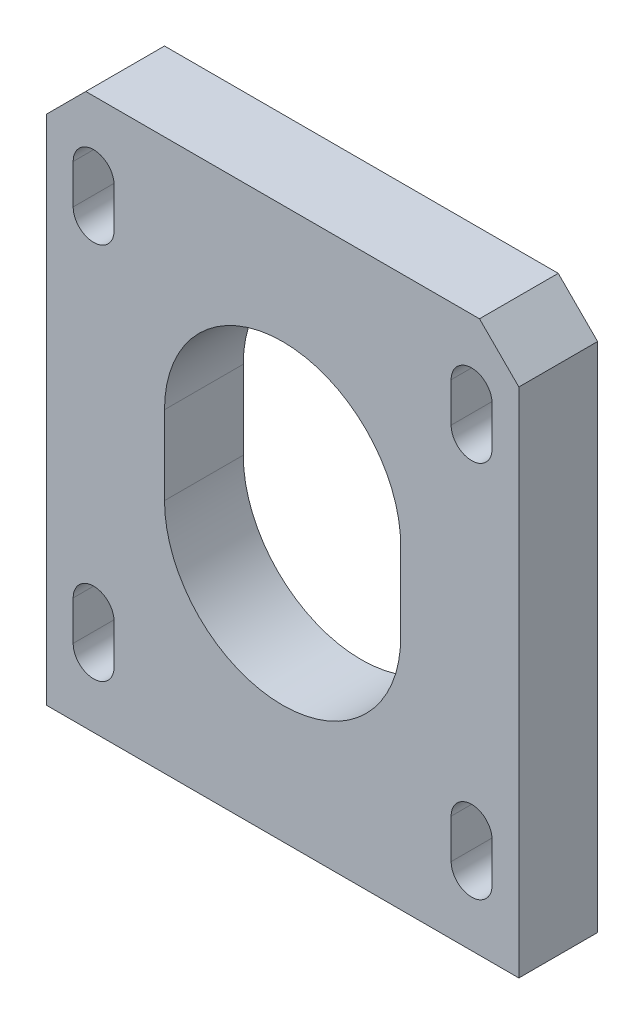
ISO-10303-21;
HEADER;
FILE_DESCRIPTION(('STEP AP214'),'2;1');
FILE_NAME('part.step','',(''),(''),'','','');
FILE_SCHEMA(('AUTOMOTIVE_DESIGN { 1 0 10303 214 1 1 1 1 }'));
ENDSEC;
DATA;
#1=APPLICATION_CONTEXT('core data for automotive mechanical design processes');
#2=APPLICATION_PROTOCOL_DEFINITION('international standard','automotive_design',2000,#1);
#3=PRODUCT_CONTEXT('',#1,'mechanical');
#4=PRODUCT('Part','Part','',(#3));
#5=PRODUCT_RELATED_PRODUCT_CATEGORY('part','',(#4));
#6=PRODUCT_DEFINITION_FORMATION('','',#4);
#7=PRODUCT_DEFINITION_CONTEXT('part definition',#1,'design');
#8=PRODUCT_DEFINITION('design','',#6,#7);
#9=PRODUCT_DEFINITION_SHAPE('','',#8);
#10=(LENGTH_UNIT() NAMED_UNIT(*) SI_UNIT(.MILLI.,.METRE.));
#11=(NAMED_UNIT(*) PLANE_ANGLE_UNIT() SI_UNIT($,.RADIAN.));
#12=(NAMED_UNIT(*) SI_UNIT($,.STERADIAN.) SOLID_ANGLE_UNIT());
#13=UNCERTAINTY_MEASURE_WITH_UNIT(LENGTH_MEASURE(1.E-05),#10,'distance_accuracy_value','');
#14=(GEOMETRIC_REPRESENTATION_CONTEXT(3) GLOBAL_UNCERTAINTY_ASSIGNED_CONTEXT((#13)) GLOBAL_UNIT_ASSIGNED_CONTEXT((#10,
#11,#12)) REPRESENTATION_CONTEXT('',''));
#15=CARTESIAN_POINT('',(0.,0.,0.));
#16=DIRECTION('',(0.,0.,1.));
#17=DIRECTION('',(1.,0.,0.));
#18=AXIS2_PLACEMENT_3D('',#15,#16,#17);
#19=CARTESIAN_POINT('',(0.,0.,10.));
#20=DIRECTION('',(1.,0.,0.));
#21=DIRECTION('',(0.,0.,-1.));
#22=AXIS2_PLACEMENT_3D('',#19,#20,#21);
#23=PLANE('',#22);
#24=DIRECTION('',(0.,-1.,0.));
#25=VECTOR('',#24,1.);
#26=CARTESIAN_POINT('',(0.,0.,10.));
#27=LINE('',#26,#25);
#28=CARTESIAN_POINT('',(0.,65.,10.));
#29=VERTEX_POINT('',#28);
#30=CARTESIAN_POINT('',(0.,0.,10.));
#31=VERTEX_POINT('',#30);
#32=EDGE_CURVE('E381',#29,#31,#27,.T.);
#33=ORIENTED_EDGE('',*,*,#32,.F.);
#34=DIRECTION('',(0.,0.,-1.));
#35=VECTOR('',#34,1.);
#36=CARTESIAN_POINT('',(0.,65.,10.));
#37=LINE('',#36,#35);
#38=CARTESIAN_POINT('',(0.,65.,0.));
#39=VERTEX_POINT('',#38);
#40=EDGE_CURVE('E11',#29,#39,#37,.T.);
#41=ORIENTED_EDGE('',*,*,#40,.T.);
#42=DIRECTION('',(0.,-1.,0.));
#43=VECTOR('',#42,1.);
#44=CARTESIAN_POINT('',(0.,0.,0.));
#45=LINE('',#44,#43);
#46=CARTESIAN_POINT('',(0.,0.,0.));
#47=VERTEX_POINT('',#46);
#48=EDGE_CURVE('E374',#39,#47,#45,.T.);
#49=ORIENTED_EDGE('',*,*,#48,.T.);
#50=DIRECTION('',(0.,0.,-1.));
#51=VECTOR('',#50,1.);
#52=CARTESIAN_POINT('',(0.,0.,10.));
#53=LINE('',#52,#51);
#54=EDGE_CURVE('E400',#31,#47,#53,.T.);
#55=ORIENTED_EDGE('',*,*,#54,.F.);
#56=EDGE_LOOP('',(#33,#41,#49,#55));
#57=FACE_BOUND('',#56,.T.);
#58=ADVANCED_FACE('F33',(#57),#23,.F.);
#59=CARTESIAN_POINT('',(0.,0.,10.));
#60=DIRECTION('',(0.,1.,0.));
#61=DIRECTION('',(0.,0.,1.));
#62=AXIS2_PLACEMENT_3D('',#59,#60,#61);
#63=PLANE('',#62);
#64=DIRECTION('',(1.,0.,0.));
#65=VECTOR('',#64,1.);
#66=CARTESIAN_POINT('',(0.,0.,0.));
#67=LINE('',#66,#65);
#68=CARTESIAN_POINT('',(60.,0.,0.));
#69=VERTEX_POINT('',#68);
#70=EDGE_CURVE('E392',#47,#69,#67,.T.);
#71=ORIENTED_EDGE('',*,*,#70,.T.);
#72=DIRECTION('',(0.,0.,-1.));
#73=VECTOR('',#72,1.);
#74=CARTESIAN_POINT('',(60.,0.,10.));
#75=LINE('',#74,#73);
#76=CARTESIAN_POINT('',(60.,0.,10.));
#77=VERTEX_POINT('',#76);
#78=EDGE_CURVE('E390',#77,#69,#75,.T.);
#79=ORIENTED_EDGE('',*,*,#78,.F.);
#80=DIRECTION('',(1.,0.,0.));
#81=VECTOR('',#80,1.);
#82=CARTESIAN_POINT('',(0.,0.,10.));
#83=LINE('',#82,#81);
#84=EDGE_CURVE('E383',#31,#77,#83,.T.);
#85=ORIENTED_EDGE('',*,*,#84,.F.);
#86=ORIENTED_EDGE('',*,*,#54,.T.);
#87=EDGE_LOOP('',(#71,#79,#85,#86));
#88=FACE_BOUND('',#87,.T.);
#89=ADVANCED_FACE('F430',(#88),#63,.F.);
#90=CARTESIAN_POINT('',(60.,0.,10.));
#91=DIRECTION('',(-1.,0.,0.));
#92=DIRECTION('',(0.,0.,1.));
#93=AXIS2_PLACEMENT_3D('',#90,#91,#92);
#94=PLANE('',#93);
#95=DIRECTION('',(0.,1.,0.));
#96=VECTOR('',#95,1.);
#97=CARTESIAN_POINT('',(60.,0.,0.));
#98=LINE('',#97,#96);
#99=CARTESIAN_POINT('',(60.,65.,0.));
#100=VERTEX_POINT('',#99);
#101=EDGE_CURVE('E394',#69,#100,#98,.T.);
#102=ORIENTED_EDGE('',*,*,#101,.T.);
#103=DIRECTION('',(0.,0.,1.));
#104=VECTOR('',#103,1.);
#105=CARTESIAN_POINT('',(60.,65.,10.));
#106=LINE('',#105,#104);
#107=CARTESIAN_POINT('',(60.,65.,10.));
#108=VERTEX_POINT('',#107);
#109=EDGE_CURVE('E56',#100,#108,#106,.T.);
#110=ORIENTED_EDGE('',*,*,#109,.T.);
#111=DIRECTION('',(0.,1.,0.));
#112=VECTOR('',#111,1.);
#113=CARTESIAN_POINT('',(60.,0.,10.));
#114=LINE('',#113,#112);
#115=EDGE_CURVE('E386',#77,#108,#114,.T.);
#116=ORIENTED_EDGE('',*,*,#115,.F.);
#117=ORIENTED_EDGE('',*,*,#78,.T.);
#118=EDGE_LOOP('',(#102,#110,#116,#117));
#119=FACE_BOUND('',#118,.T.);
#120=ADVANCED_FACE('F426',(#119),#94,.F.);
#121=CARTESIAN_POINT('',(0.,70.,10.));
#122=DIRECTION('',(0.,-1.,0.));
#123=DIRECTION('',(0.,0.,-1.));
#124=AXIS2_PLACEMENT_3D('',#121,#122,#123);
#125=PLANE('',#124);
#126=DIRECTION('',(-1.,0.,0.));
#127=VECTOR('',#126,1.);
#128=CARTESIAN_POINT('',(0.,70.,10.));
#129=LINE('',#128,#127);
#130=CARTESIAN_POINT('',(55.,70.,10.));
#131=VERTEX_POINT('',#130);
#132=CARTESIAN_POINT('',(5.00000000000003,70.,10.));
#133=VERTEX_POINT('',#132);
#134=EDGE_CURVE('E388',#131,#133,#129,.T.);
#135=ORIENTED_EDGE('',*,*,#134,.F.);
#136=DIRECTION('',(0.,0.,-1.));
#137=VECTOR('',#136,1.);
#138=CARTESIAN_POINT('',(55.,70.,10.));
#139=LINE('',#138,#137);
#140=CARTESIAN_POINT('',(55.,70.,0.));
#141=VERTEX_POINT('',#140);
#142=EDGE_CURVE('E405',#131,#141,#139,.T.);
#143=ORIENTED_EDGE('',*,*,#142,.T.);
#144=DIRECTION('',(-1.,0.,0.));
#145=VECTOR('',#144,1.);
#146=CARTESIAN_POINT('',(0.,70.,0.));
#147=LINE('',#146,#145);
#148=CARTESIAN_POINT('',(5.00000000000003,70.,0.));
#149=VERTEX_POINT('',#148);
#150=EDGE_CURVE('E384',#141,#149,#147,.T.);
#151=ORIENTED_EDGE('',*,*,#150,.T.);
#152=DIRECTION('',(0.,0.,1.));
#153=VECTOR('',#152,1.);
#154=CARTESIAN_POINT('',(5.00000000000003,70.,10.));
#155=LINE('',#154,#153);
#156=EDGE_CURVE('E403',#149,#133,#155,.T.);
#157=ORIENTED_EDGE('',*,*,#156,.T.);
#158=EDGE_LOOP('',(#135,#143,#151,#157));
#159=FACE_BOUND('',#158,.T.);
#160=ADVANCED_FACE('F419',(#159),#125,.F.);
#161=CARTESIAN_POINT('',(0.,0.,10.));
#162=DIRECTION('',(0.,0.,-1.));
#163=DIRECTION('',(-1.,0.,0.));
#164=AXIS2_PLACEMENT_3D('',#161,#162,#163);
#165=PLANE('',#164);
#166=DIRECTION('',(0.,-1.,0.));
#167=VECTOR('',#166,1.);
#168=CARTESIAN_POINT('',(51.4,61.5,10.));
#169=LINE('',#168,#167);
#170=CARTESIAN_POINT('',(51.4,61.5,10.));
#171=VERTEX_POINT('',#170);
#172=CARTESIAN_POINT('',(51.4,56.5,10.));
#173=VERTEX_POINT('',#172);
#174=EDGE_CURVE('E243',#171,#173,#169,.T.);
#175=ORIENTED_EDGE('',*,*,#174,.F.);
#176=CARTESIAN_POINT('',(54.,61.5,10.));
#177=DIRECTION('',(0.,0.,1.));
#178=DIRECTION('',(-1.,0.,0.));
#179=AXIS2_PLACEMENT_3D('',#176,#177,#178);
#180=CIRCLE('',#179,2.59999999999998);
#181=CARTESIAN_POINT('',(56.6,61.5,10.));
#182=VERTEX_POINT('',#181);
#183=EDGE_CURVE('E216',#182,#171,#180,.T.);
#184=ORIENTED_EDGE('',*,*,#183,.F.);
#185=DIRECTION('',(0.,1.,0.));
#186=VECTOR('',#185,1.);
#187=CARTESIAN_POINT('',(56.6,61.5,10.));
#188=LINE('',#187,#186);
#189=CARTESIAN_POINT('',(56.6,56.5,10.));
#190=VERTEX_POINT('',#189);
#191=EDGE_CURVE('E234',#190,#182,#188,.T.);
#192=ORIENTED_EDGE('',*,*,#191,.F.);
#193=CARTESIAN_POINT('',(54.,56.5,10.));
#194=DIRECTION('',(0.,0.,1.));
#195=DIRECTION('',(-1.,0.,0.));
#196=AXIS2_PLACEMENT_3D('',#193,#194,#195);
#197=CIRCLE('',#196,2.59999999999998);
#198=EDGE_CURVE('E237',#173,#190,#197,.T.);
#199=ORIENTED_EDGE('',*,*,#198,.F.);
#200=EDGE_LOOP('',(#175,#184,#192,#199));
#201=FACE_BOUND('',#200,.T.);
#202=DIRECTION('',(0.,1.,0.));
#203=VECTOR('',#202,1.);
#204=CARTESIAN_POINT('',(56.6,8.49999999999997,10.));
#205=LINE('',#204,#203);
#206=CARTESIAN_POINT('',(56.6,8.49999999999997,10.));
#207=VERTEX_POINT('',#206);
#208=CARTESIAN_POINT('',(56.6,13.5,10.));
#209=VERTEX_POINT('',#208);
#210=EDGE_CURVE('E270',#207,#209,#205,.T.);
#211=ORIENTED_EDGE('',*,*,#210,.F.);
#212=CARTESIAN_POINT('',(54.,8.5,10.));
#213=DIRECTION('',(0.,0.,1.));
#214=DIRECTION('',(1.,0.,0.));
#215=AXIS2_PLACEMENT_3D('',#212,#213,#214);
#216=CIRCLE('',#215,2.59999999999998);
#217=CARTESIAN_POINT('',(51.4,8.49999999999997,10.));
#218=VERTEX_POINT('',#217);
#219=EDGE_CURVE('E268',#218,#207,#216,.T.);
#220=ORIENTED_EDGE('',*,*,#219,.F.);
#221=DIRECTION('',(0.,-1.,0.));
#222=VECTOR('',#221,1.);
#223=CARTESIAN_POINT('',(51.4,8.49999999999997,10.));
#224=LINE('',#223,#222);
#225=CARTESIAN_POINT('',(51.4,13.5,10.));
#226=VERTEX_POINT('',#225);
#227=EDGE_CURVE('E258',#226,#218,#224,.T.);
#228=ORIENTED_EDGE('',*,*,#227,.F.);
#229=CARTESIAN_POINT('',(54.,13.5,10.));
#230=DIRECTION('',(0.,0.,1.));
#231=DIRECTION('',(1.,0.,0.));
#232=AXIS2_PLACEMENT_3D('',#229,#230,#231);
#233=CIRCLE('',#232,2.59999999999998);
#234=EDGE_CURVE('E274',#209,#226,#233,.T.);
#235=ORIENTED_EDGE('',*,*,#234,.F.);
#236=EDGE_LOOP('',(#211,#220,#228,#235));
#237=FACE_BOUND('',#236,.T.);
#238=DIRECTION('',(0.,1.,0.));
#239=VECTOR('',#238,1.);
#240=CARTESIAN_POINT('',(8.59999999999998,8.49999999999997,10.));
#241=LINE('',#240,#239);
#242=CARTESIAN_POINT('',(8.59999999999998,8.49999999999997,10.));
#243=VERTEX_POINT('',#242);
#244=CARTESIAN_POINT('',(8.59999999999998,13.5,10.));
#245=VERTEX_POINT('',#244);
#246=EDGE_CURVE('E302',#243,#245,#241,.T.);
#247=ORIENTED_EDGE('',*,*,#246,.F.);
#248=CARTESIAN_POINT('',(6.,8.5,10.));
#249=DIRECTION('',(0.,0.,1.));
#250=DIRECTION('',(-1.,0.,0.));
#251=AXIS2_PLACEMENT_3D('',#248,#249,#250);
#252=CIRCLE('',#251,2.59999999999998);
#253=CARTESIAN_POINT('',(3.40000000000003,8.49999999999997,10.));
#254=VERTEX_POINT('',#253);
#255=EDGE_CURVE('E300',#254,#243,#252,.T.);
#256=ORIENTED_EDGE('',*,*,#255,.F.);
#257=DIRECTION('',(0.,-1.,0.));
#258=VECTOR('',#257,1.);
#259=CARTESIAN_POINT('',(3.40000000000003,8.49999999999997,10.));
#260=LINE('',#259,#258);
#261=CARTESIAN_POINT('',(3.40000000000002,13.5,10.));
#262=VERTEX_POINT('',#261);
#263=EDGE_CURVE('E290',#262,#254,#260,.T.);
#264=ORIENTED_EDGE('',*,*,#263,.F.);
#265=CARTESIAN_POINT('',(6.,13.5,10.));
#266=DIRECTION('',(0.,0.,1.));
#267=DIRECTION('',(-1.,0.,0.));
#268=AXIS2_PLACEMENT_3D('',#265,#266,#267);
#269=CIRCLE('',#268,2.59999999999998);
#270=EDGE_CURVE('E306',#245,#262,#269,.T.);
#271=ORIENTED_EDGE('',*,*,#270,.F.);
#272=EDGE_LOOP('',(#247,#256,#264,#271));
#273=FACE_BOUND('',#272,.T.);
#274=DIRECTION('',(0.,1.,0.));
#275=VECTOR('',#274,1.);
#276=CARTESIAN_POINT('',(45.,30.,10.));
#277=LINE('',#276,#275);
#278=CARTESIAN_POINT('',(45.,30.,10.));
#279=VERTEX_POINT('',#278);
#280=CARTESIAN_POINT('',(45.,40.,10.));
#281=VERTEX_POINT('',#280);
#282=EDGE_CURVE('E334',#279,#281,#277,.T.);
#283=ORIENTED_EDGE('',*,*,#282,.F.);
#284=CARTESIAN_POINT('',(30.,30.,10.));
#285=DIRECTION('',(0.,0.,1.));
#286=DIRECTION('',(1.,0.,0.));
#287=AXIS2_PLACEMENT_3D('',#284,#285,#286);
#288=CIRCLE('',#287,15.);
#289=CARTESIAN_POINT('',(15.,30.,10.));
#290=VERTEX_POINT('',#289);
#291=EDGE_CURVE('E332',#290,#279,#288,.T.);
#292=ORIENTED_EDGE('',*,*,#291,.F.);
#293=DIRECTION('',(0.,-1.,0.));
#294=VECTOR('',#293,1.);
#295=CARTESIAN_POINT('',(15.,30.,10.));
#296=LINE('',#295,#294);
#297=CARTESIAN_POINT('',(15.,40.,10.));
#298=VERTEX_POINT('',#297);
#299=EDGE_CURVE('E322',#298,#290,#296,.T.);
#300=ORIENTED_EDGE('',*,*,#299,.F.);
#301=CARTESIAN_POINT('',(30.,40.,10.));
#302=DIRECTION('',(0.,0.,1.));
#303=DIRECTION('',(1.,0.,0.));
#304=AXIS2_PLACEMENT_3D('',#301,#302,#303);
#305=CIRCLE('',#304,15.);
#306=EDGE_CURVE('E337',#281,#298,#305,.T.);
#307=ORIENTED_EDGE('',*,*,#306,.F.);
#308=EDGE_LOOP('',(#283,#292,#300,#307));
#309=FACE_BOUND('',#308,.T.);
#310=DIRECTION('',(0.,-1.,0.));
#311=VECTOR('',#310,1.);
#312=CARTESIAN_POINT('',(3.40000000000001,61.5,10.));
#313=LINE('',#312,#311);
#314=CARTESIAN_POINT('',(3.40000000000001,61.5,10.));
#315=VERTEX_POINT('',#314);
#316=CARTESIAN_POINT('',(3.40000000000001,56.5,10.));
#317=VERTEX_POINT('',#316);
#318=EDGE_CURVE('E364',#315,#317,#313,.T.);
#319=ORIENTED_EDGE('',*,*,#318,.F.);
#320=CARTESIAN_POINT('',(6.,61.5,10.));
#321=DIRECTION('',(0.,0.,1.));
#322=DIRECTION('',(1.,0.,0.));
#323=AXIS2_PLACEMENT_3D('',#320,#321,#322);
#324=CIRCLE('',#323,2.59999999999998);
#325=CARTESIAN_POINT('',(8.59999999999998,61.5,10.));
#326=VERTEX_POINT('',#325);
#327=EDGE_CURVE('E250',#326,#315,#324,.T.);
#328=ORIENTED_EDGE('',*,*,#327,.F.);
#329=DIRECTION('',(0.,1.,0.));
#330=VECTOR('',#329,1.);
#331=CARTESIAN_POINT('',(8.59999999999998,61.5,10.));
#332=LINE('',#331,#330);
#333=CARTESIAN_POINT('',(8.59999999999999,56.5,10.));
#334=VERTEX_POINT('',#333);
#335=EDGE_CURVE('E353',#334,#326,#332,.T.);
#336=ORIENTED_EDGE('',*,*,#335,.F.);
#337=CARTESIAN_POINT('',(6.,56.5,10.));
#338=DIRECTION('',(0.,0.,1.));
#339=DIRECTION('',(1.,0.,0.));
#340=AXIS2_PLACEMENT_3D('',#337,#338,#339);
#341=CIRCLE('',#340,2.59999999999998);
#342=EDGE_CURVE('E367',#317,#334,#341,.T.);
#343=ORIENTED_EDGE('',*,*,#342,.F.);
#344=EDGE_LOOP('',(#319,#328,#336,#343));
#345=FACE_BOUND('',#344,.T.);
#346=ORIENTED_EDGE('',*,*,#115,.T.);
#347=DIRECTION('',(0.707106781186547,-0.707106781186549,0.));
#348=VECTOR('',#347,1.);
#349=CARTESIAN_POINT('',(55.,70.,10.));
#350=LINE('',#349,#348);
#351=EDGE_CURVE('E41',#108,#131,#350,.F.);
#352=ORIENTED_EDGE('',*,*,#351,.T.);
#353=ORIENTED_EDGE('',*,*,#134,.T.);
#354=DIRECTION('',(0.707106781186549,0.707106781186547,0.));
#355=VECTOR('',#354,1.);
#356=CARTESIAN_POINT('',(0.,65.,10.));
#357=LINE('',#356,#355);
#358=EDGE_CURVE('E48',#133,#29,#357,.F.);
#359=ORIENTED_EDGE('',*,*,#358,.T.);
#360=ORIENTED_EDGE('',*,*,#32,.T.);
#361=ORIENTED_EDGE('',*,*,#84,.T.);
#362=EDGE_LOOP('',(#346,#352,#353,#359,#360,#361));
#363=FACE_BOUND('',#362,.T.);
#364=ADVANCED_FACE('F415',(#201,#237,#273,#309,#345,#363),#165,.F.);
#365=CARTESIAN_POINT('',(0.,0.,0.));
#366=DIRECTION('',(0.,0.,-1.));
#367=DIRECTION('',(-1.,0.,0.));
#368=AXIS2_PLACEMENT_3D('',#365,#366,#367);
#369=PLANE('',#368);
#370=CARTESIAN_POINT('',(54.,61.5,0.));
#371=DIRECTION('',(0.,0.,1.));
#372=DIRECTION('',(-1.,0.,0.));
#373=AXIS2_PLACEMENT_3D('',#370,#371,#372);
#374=CIRCLE('',#373,2.59999999999998);
#375=CARTESIAN_POINT('',(56.6,61.5,0.));
#376=VERTEX_POINT('',#375);
#377=CARTESIAN_POINT('',(51.4,61.5,0.));
#378=VERTEX_POINT('',#377);
#379=EDGE_CURVE('E213',#376,#378,#374,.T.);
#380=ORIENTED_EDGE('',*,*,#379,.T.);
#381=DIRECTION('',(0.,-1.,0.));
#382=VECTOR('',#381,1.);
#383=CARTESIAN_POINT('',(51.4,61.5,0.));
#384=LINE('',#383,#382);
#385=CARTESIAN_POINT('',(51.4,56.5,0.));
#386=VERTEX_POINT('',#385);
#387=EDGE_CURVE('E225',#378,#386,#384,.T.);
#388=ORIENTED_EDGE('',*,*,#387,.T.);
#389=CARTESIAN_POINT('',(54.,56.5,0.));
#390=DIRECTION('',(0.,0.,1.));
#391=DIRECTION('',(-1.,0.,0.));
#392=AXIS2_PLACEMENT_3D('',#389,#390,#391);
#393=CIRCLE('',#392,2.59999999999998);
#394=CARTESIAN_POINT('',(56.6,56.5,0.));
#395=VERTEX_POINT('',#394);
#396=EDGE_CURVE('E229',#386,#395,#393,.T.);
#397=ORIENTED_EDGE('',*,*,#396,.T.);
#398=DIRECTION('',(0.,1.,0.));
#399=VECTOR('',#398,1.);
#400=CARTESIAN_POINT('',(56.6,61.5,0.));
#401=LINE('',#400,#399);
#402=EDGE_CURVE('E221',#395,#376,#401,.T.);
#403=ORIENTED_EDGE('',*,*,#402,.T.);
#404=EDGE_LOOP('',(#380,#388,#397,#403));
#405=FACE_BOUND('',#404,.T.);
#406=CARTESIAN_POINT('',(54.,8.5,0.));
#407=DIRECTION('',(0.,0.,1.));
#408=DIRECTION('',(1.,0.,0.));
#409=AXIS2_PLACEMENT_3D('',#406,#407,#408);
#410=CIRCLE('',#409,2.59999999999998);
#411=CARTESIAN_POINT('',(51.4,8.49999999999997,0.));
#412=VERTEX_POINT('',#411);
#413=CARTESIAN_POINT('',(56.6,8.49999999999997,0.));
#414=VERTEX_POINT('',#413);
#415=EDGE_CURVE('E254',#412,#414,#410,.T.);
#416=ORIENTED_EDGE('',*,*,#415,.T.);
#417=DIRECTION('',(0.,1.,0.));
#418=VECTOR('',#417,1.);
#419=CARTESIAN_POINT('',(56.6,8.49999999999997,0.));
#420=LINE('',#419,#418);
#421=CARTESIAN_POINT('',(56.6,13.5,0.));
#422=VERTEX_POINT('',#421);
#423=EDGE_CURVE('E257',#414,#422,#420,.T.);
#424=ORIENTED_EDGE('',*,*,#423,.T.);
#425=CARTESIAN_POINT('',(54.,13.5,0.));
#426=DIRECTION('',(0.,0.,1.));
#427=DIRECTION('',(1.,0.,0.));
#428=AXIS2_PLACEMENT_3D('',#425,#426,#427);
#429=CIRCLE('',#428,2.59999999999998);
#430=CARTESIAN_POINT('',(51.4,13.5,0.));
#431=VERTEX_POINT('',#430);
#432=EDGE_CURVE('E261',#422,#431,#429,.T.);
#433=ORIENTED_EDGE('',*,*,#432,.T.);
#434=DIRECTION('',(0.,-1.,0.));
#435=VECTOR('',#434,1.);
#436=CARTESIAN_POINT('',(51.4,8.49999999999997,0.));
#437=LINE('',#436,#435);
#438=EDGE_CURVE('E264',#431,#412,#437,.T.);
#439=ORIENTED_EDGE('',*,*,#438,.T.);
#440=EDGE_LOOP('',(#416,#424,#433,#439));
#441=FACE_BOUND('',#440,.T.);
#442=CARTESIAN_POINT('',(6.,8.5,0.));
#443=DIRECTION('',(0.,0.,1.));
#444=DIRECTION('',(-1.,0.,0.));
#445=AXIS2_PLACEMENT_3D('',#442,#443,#444);
#446=CIRCLE('',#445,2.59999999999998);
#447=CARTESIAN_POINT('',(3.40000000000003,8.49999999999997,0.));
#448=VERTEX_POINT('',#447);
#449=CARTESIAN_POINT('',(8.59999999999998,8.49999999999997,0.));
#450=VERTEX_POINT('',#449);
#451=EDGE_CURVE('E286',#448,#450,#446,.T.);
#452=ORIENTED_EDGE('',*,*,#451,.T.);
#453=DIRECTION('',(0.,1.,0.));
#454=VECTOR('',#453,1.);
#455=CARTESIAN_POINT('',(8.59999999999998,8.49999999999997,0.));
#456=LINE('',#455,#454);
#457=CARTESIAN_POINT('',(8.59999999999998,13.5,0.));
#458=VERTEX_POINT('',#457);
#459=EDGE_CURVE('E289',#450,#458,#456,.T.);
#460=ORIENTED_EDGE('',*,*,#459,.T.);
#461=CARTESIAN_POINT('',(6.,13.5,0.));
#462=DIRECTION('',(0.,0.,1.));
#463=DIRECTION('',(-1.,0.,0.));
#464=AXIS2_PLACEMENT_3D('',#461,#462,#463);
#465=CIRCLE('',#464,2.59999999999998);
#466=CARTESIAN_POINT('',(3.40000000000002,13.5,0.));
#467=VERTEX_POINT('',#466);
#468=EDGE_CURVE('E293',#458,#467,#465,.T.);
#469=ORIENTED_EDGE('',*,*,#468,.T.);
#470=DIRECTION('',(0.,-1.,0.));
#471=VECTOR('',#470,1.);
#472=CARTESIAN_POINT('',(3.40000000000003,8.49999999999997,0.));
#473=LINE('',#472,#471);
#474=EDGE_CURVE('E296',#467,#448,#473,.T.);
#475=ORIENTED_EDGE('',*,*,#474,.T.);
#476=EDGE_LOOP('',(#452,#460,#469,#475));
#477=FACE_BOUND('',#476,.T.);
#478=CARTESIAN_POINT('',(30.,30.,0.));
#479=DIRECTION('',(0.,0.,1.));
#480=DIRECTION('',(1.,0.,0.));
#481=AXIS2_PLACEMENT_3D('',#478,#479,#480);
#482=CIRCLE('',#481,15.);
#483=CARTESIAN_POINT('',(15.,30.,0.));
#484=VERTEX_POINT('',#483);
#485=CARTESIAN_POINT('',(45.,30.,0.));
#486=VERTEX_POINT('',#485);
#487=EDGE_CURVE('E318',#484,#486,#482,.T.);
#488=ORIENTED_EDGE('',*,*,#487,.T.);
#489=DIRECTION('',(0.,1.,0.));
#490=VECTOR('',#489,1.);
#491=CARTESIAN_POINT('',(45.,30.,0.));
#492=LINE('',#491,#490);
#493=CARTESIAN_POINT('',(45.,40.,0.));
#494=VERTEX_POINT('',#493);
#495=EDGE_CURVE('E321',#486,#494,#492,.T.);
#496=ORIENTED_EDGE('',*,*,#495,.T.);
#497=CARTESIAN_POINT('',(30.,40.,0.));
#498=DIRECTION('',(0.,0.,1.));
#499=DIRECTION('',(1.,0.,0.));
#500=AXIS2_PLACEMENT_3D('',#497,#498,#499);
#501=CIRCLE('',#500,15.);
#502=CARTESIAN_POINT('',(15.,40.,0.));
#503=VERTEX_POINT('',#502);
#504=EDGE_CURVE('E325',#494,#503,#501,.T.);
#505=ORIENTED_EDGE('',*,*,#504,.T.);
#506=DIRECTION('',(0.,-1.,0.));
#507=VECTOR('',#506,1.);
#508=CARTESIAN_POINT('',(15.,30.,0.));
#509=LINE('',#508,#507);
#510=EDGE_CURVE('E328',#503,#484,#509,.T.);
#511=ORIENTED_EDGE('',*,*,#510,.T.);
#512=EDGE_LOOP('',(#488,#496,#505,#511));
#513=FACE_BOUND('',#512,.T.);
#514=CARTESIAN_POINT('',(6.,61.5,0.));
#515=DIRECTION('',(0.,0.,1.));
#516=DIRECTION('',(1.,0.,0.));
#517=AXIS2_PLACEMENT_3D('',#514,#515,#516);
#518=CIRCLE('',#517,2.59999999999998);
#519=CARTESIAN_POINT('',(8.59999999999998,61.5,0.));
#520=VERTEX_POINT('',#519);
#521=CARTESIAN_POINT('',(3.40000000000001,61.5,0.));
#522=VERTEX_POINT('',#521);
#523=EDGE_CURVE('E349',#520,#522,#518,.T.);
#524=ORIENTED_EDGE('',*,*,#523,.T.);
#525=DIRECTION('',(0.,-1.,0.));
#526=VECTOR('',#525,1.);
#527=CARTESIAN_POINT('',(3.40000000000001,61.5,0.));
#528=LINE('',#527,#526);
#529=CARTESIAN_POINT('',(3.40000000000002,56.5,0.));
#530=VERTEX_POINT('',#529);
#531=EDGE_CURVE('E352',#522,#530,#528,.T.);
#532=ORIENTED_EDGE('',*,*,#531,.T.);
#533=CARTESIAN_POINT('',(6.,56.5,0.));
#534=DIRECTION('',(0.,0.,1.));
#535=DIRECTION('',(1.,0.,0.));
#536=AXIS2_PLACEMENT_3D('',#533,#534,#535);
#537=CIRCLE('',#536,2.59999999999998);
#538=CARTESIAN_POINT('',(8.59999999999999,56.5,0.));
#539=VERTEX_POINT('',#538);
#540=EDGE_CURVE('E356',#530,#539,#537,.T.);
#541=ORIENTED_EDGE('',*,*,#540,.T.);
#542=DIRECTION('',(0.,1.,0.));
#543=VECTOR('',#542,1.);
#544=CARTESIAN_POINT('',(8.59999999999998,61.5,0.));
#545=LINE('',#544,#543);
#546=EDGE_CURVE('E359',#539,#520,#545,.T.);
#547=ORIENTED_EDGE('',*,*,#546,.T.);
#548=EDGE_LOOP('',(#524,#532,#541,#547));
#549=FACE_BOUND('',#548,.T.);
#550=ORIENTED_EDGE('',*,*,#150,.F.);
#551=DIRECTION('',(-0.707106781186547,0.707106781186549,0.));
#552=VECTOR('',#551,1.);
#553=CARTESIAN_POINT('',(62.5000000000001,62.4999999999999,0.));
#554=LINE('',#553,#552);
#555=EDGE_CURVE('E410',#141,#100,#554,.F.);
#556=ORIENTED_EDGE('',*,*,#555,.T.);
#557=ORIENTED_EDGE('',*,*,#101,.F.);
#558=ORIENTED_EDGE('',*,*,#70,.F.);
#559=ORIENTED_EDGE('',*,*,#48,.F.);
#560=DIRECTION('',(-0.707106781186549,-0.707106781186547,0.));
#561=VECTOR('',#560,1.);
#562=CARTESIAN_POINT('',(-32.5,32.5000000000001,0.));
#563=LINE('',#562,#561);
#564=EDGE_CURVE('E408',#39,#149,#563,.F.);
#565=ORIENTED_EDGE('',*,*,#564,.T.);
#566=EDGE_LOOP('',(#550,#556,#557,#558,#559,#565));
#567=FACE_BOUND('',#566,.T.);
#568=ADVANCED_FACE('F231',(#405,#441,#477,#513,#549,#567),#369,.T.);
#569=CARTESIAN_POINT('',(6.,61.5,0.));
#570=DIRECTION('',(0.,0.,1.));
#571=DIRECTION('',(1.,0.,0.));
#572=AXIS2_PLACEMENT_3D('',#569,#570,#571);
#573=CYLINDRICAL_SURFACE('',#572,2.59999999999998);
#574=ORIENTED_EDGE('',*,*,#327,.T.);
#575=DIRECTION('',(0.,0.,1.));
#576=VECTOR('',#575,1.);
#577=CARTESIAN_POINT('',(3.40000000000001,61.5,0.));
#578=LINE('',#577,#576);
#579=EDGE_CURVE('E362',#522,#315,#578,.T.);
#580=ORIENTED_EDGE('',*,*,#579,.F.);
#581=ORIENTED_EDGE('',*,*,#523,.F.);
#582=DIRECTION('',(0.,0.,1.));
#583=VECTOR('',#582,1.);
#584=CARTESIAN_POINT('',(8.59999999999998,61.5,0.));
#585=LINE('',#584,#583);
#586=EDGE_CURVE('E372',#520,#326,#585,.T.);
#587=ORIENTED_EDGE('',*,*,#586,.T.);
#588=EDGE_LOOP('',(#574,#580,#581,#587));
#589=FACE_BOUND('',#588,.T.);
#590=ADVANCED_FACE('F454',(#589),#573,.F.);
#591=CARTESIAN_POINT('',(8.59999999999998,61.5,0.));
#592=DIRECTION('',(1.,0.,0.));
#593=DIRECTION('',(0.,1.,0.));
#594=AXIS2_PLACEMENT_3D('',#591,#592,#593);
#595=PLANE('',#594);
#596=ORIENTED_EDGE('',*,*,#335,.T.);
#597=ORIENTED_EDGE('',*,*,#586,.F.);
#598=ORIENTED_EDGE('',*,*,#546,.F.);
#599=DIRECTION('',(0.,0.,1.));
#600=VECTOR('',#599,1.);
#601=CARTESIAN_POINT('',(8.59999999999999,56.5,0.));
#602=LINE('',#601,#600);
#603=EDGE_CURVE('E375',#539,#334,#602,.T.);
#604=ORIENTED_EDGE('',*,*,#603,.T.);
#605=EDGE_LOOP('',(#596,#597,#598,#604));
#606=FACE_BOUND('',#605,.T.);
#607=ADVANCED_FACE('F460',(#606),#595,.F.);
#608=CARTESIAN_POINT('',(6.,56.5,0.));
#609=DIRECTION('',(0.,0.,1.));
#610=DIRECTION('',(1.,0.,0.));
#611=AXIS2_PLACEMENT_3D('',#608,#609,#610);
#612=CYLINDRICAL_SURFACE('',#611,2.59999999999998);
#613=ORIENTED_EDGE('',*,*,#342,.T.);
#614=ORIENTED_EDGE('',*,*,#603,.F.);
#615=ORIENTED_EDGE('',*,*,#540,.F.);
#616=DIRECTION('',(0.,0.,1.));
#617=VECTOR('',#616,1.);
#618=CARTESIAN_POINT('',(3.40000000000001,56.5,0.));
#619=LINE('',#618,#617);
#620=EDGE_CURVE('E377',#530,#317,#619,.T.);
#621=ORIENTED_EDGE('',*,*,#620,.T.);
#622=EDGE_LOOP('',(#613,#614,#615,#621));
#623=FACE_BOUND('',#622,.T.);
#624=ADVANCED_FACE('F466',(#623),#612,.F.);
#625=CARTESIAN_POINT('',(3.40000000000001,61.5,0.));
#626=DIRECTION('',(-1.,0.,0.));
#627=DIRECTION('',(0.,-1.,0.));
#628=AXIS2_PLACEMENT_3D('',#625,#626,#627);
#629=PLANE('',#628);
#630=ORIENTED_EDGE('',*,*,#318,.T.);
#631=ORIENTED_EDGE('',*,*,#620,.F.);
#632=ORIENTED_EDGE('',*,*,#531,.F.);
#633=ORIENTED_EDGE('',*,*,#579,.T.);
#634=EDGE_LOOP('',(#630,#631,#632,#633));
#635=FACE_BOUND('',#634,.T.);
#636=ADVANCED_FACE('F462',(#635),#629,.F.);
#637=CARTESIAN_POINT('',(30.,30.,0.));
#638=DIRECTION('',(0.,0.,1.));
#639=DIRECTION('',(1.,0.,0.));
#640=AXIS2_PLACEMENT_3D('',#637,#638,#639);
#641=CYLINDRICAL_SURFACE('',#640,15.);
#642=ORIENTED_EDGE('',*,*,#291,.T.);
#643=DIRECTION('',(0.,0.,1.));
#644=VECTOR('',#643,1.);
#645=CARTESIAN_POINT('',(45.,30.,0.));
#646=LINE('',#645,#644);
#647=EDGE_CURVE('E331',#486,#279,#646,.T.);
#648=ORIENTED_EDGE('',*,*,#647,.F.);
#649=ORIENTED_EDGE('',*,*,#487,.F.);
#650=DIRECTION('',(0.,0.,1.));
#651=VECTOR('',#650,1.);
#652=CARTESIAN_POINT('',(15.,30.,0.));
#653=LINE('',#652,#651);
#654=EDGE_CURVE('E303',#484,#290,#653,.T.);
#655=ORIENTED_EDGE('',*,*,#654,.T.);
#656=EDGE_LOOP('',(#642,#648,#649,#655));
#657=FACE_BOUND('',#656,.T.);
#658=ADVANCED_FACE('F465',(#657),#641,.F.);
#659=CARTESIAN_POINT('',(15.,30.,0.));
#660=DIRECTION('',(-1.,0.,0.));
#661=DIRECTION('',(0.,-1.,0.));
#662=AXIS2_PLACEMENT_3D('',#659,#660,#661);
#663=PLANE('',#662);
#664=ORIENTED_EDGE('',*,*,#299,.T.);
#665=ORIENTED_EDGE('',*,*,#654,.F.);
#666=ORIENTED_EDGE('',*,*,#510,.F.);
#667=DIRECTION('',(0.,0.,1.));
#668=VECTOR('',#667,1.);
#669=CARTESIAN_POINT('',(15.,40.,0.));
#670=LINE('',#669,#668);
#671=EDGE_CURVE('E343',#503,#298,#670,.T.);
#672=ORIENTED_EDGE('',*,*,#671,.T.);
#673=EDGE_LOOP('',(#664,#665,#666,#672));
#674=FACE_BOUND('',#673,.T.);
#675=ADVANCED_FACE('F476',(#674),#663,.F.);
#676=CARTESIAN_POINT('',(30.,40.,0.));
#677=DIRECTION('',(0.,0.,1.));
#678=DIRECTION('',(1.,0.,0.));
#679=AXIS2_PLACEMENT_3D('',#676,#677,#678);
#680=CYLINDRICAL_SURFACE('',#679,15.);
#681=ORIENTED_EDGE('',*,*,#306,.T.);
#682=ORIENTED_EDGE('',*,*,#671,.F.);
#683=ORIENTED_EDGE('',*,*,#504,.F.);
#684=DIRECTION('',(0.,0.,1.));
#685=VECTOR('',#684,1.);
#686=CARTESIAN_POINT('',(45.,40.,0.));
#687=LINE('',#686,#685);
#688=EDGE_CURVE('E345',#494,#281,#687,.T.);
#689=ORIENTED_EDGE('',*,*,#688,.T.);
#690=EDGE_LOOP('',(#681,#682,#683,#689));
#691=FACE_BOUND('',#690,.T.);
#692=ADVANCED_FACE('F482',(#691),#680,.F.);
#693=CARTESIAN_POINT('',(45.,30.,0.));
#694=DIRECTION('',(1.,0.,0.));
#695=DIRECTION('',(0.,0.,-1.));
#696=AXIS2_PLACEMENT_3D('',#693,#694,#695);
#697=PLANE('',#696);
#698=ORIENTED_EDGE('',*,*,#282,.T.);
#699=ORIENTED_EDGE('',*,*,#688,.F.);
#700=ORIENTED_EDGE('',*,*,#495,.F.);
#701=ORIENTED_EDGE('',*,*,#647,.T.);
#702=EDGE_LOOP('',(#698,#699,#700,#701));
#703=FACE_BOUND('',#702,.T.);
#704=ADVANCED_FACE('F478',(#703),#697,.F.);
#705=CARTESIAN_POINT('',(6.,8.5,0.));
#706=DIRECTION('',(0.,0.,1.));
#707=DIRECTION('',(1.,0.,0.));
#708=AXIS2_PLACEMENT_3D('',#705,#706,#707);
#709=CYLINDRICAL_SURFACE('',#708,2.59999999999998);
#710=ORIENTED_EDGE('',*,*,#255,.T.);
#711=DIRECTION('',(0.,0.,1.));
#712=VECTOR('',#711,1.);
#713=CARTESIAN_POINT('',(8.59999999999998,8.49999999999997,0.));
#714=LINE('',#713,#712);
#715=EDGE_CURVE('E299',#450,#243,#714,.T.);
#716=ORIENTED_EDGE('',*,*,#715,.F.);
#717=ORIENTED_EDGE('',*,*,#451,.F.);
#718=DIRECTION('',(0.,0.,1.));
#719=VECTOR('',#718,1.);
#720=CARTESIAN_POINT('',(3.40000000000003,8.49999999999997,0.));
#721=LINE('',#720,#719);
#722=EDGE_CURVE('E271',#448,#254,#721,.T.);
#723=ORIENTED_EDGE('',*,*,#722,.T.);
#724=EDGE_LOOP('',(#710,#716,#717,#723));
#725=FACE_BOUND('',#724,.T.);
#726=ADVANCED_FACE('F481',(#725),#709,.F.);
#727=CARTESIAN_POINT('',(3.40000000000003,8.49999999999997,0.));
#728=DIRECTION('',(-1.,0.,0.));
#729=DIRECTION('',(0.,-1.,0.));
#730=AXIS2_PLACEMENT_3D('',#727,#728,#729);
#731=PLANE('',#730);
#732=ORIENTED_EDGE('',*,*,#263,.T.);
#733=ORIENTED_EDGE('',*,*,#722,.F.);
#734=ORIENTED_EDGE('',*,*,#474,.F.);
#735=DIRECTION('',(0.,0.,1.));
#736=VECTOR('',#735,1.);
#737=CARTESIAN_POINT('',(3.40000000000002,13.5,0.));
#738=LINE('',#737,#736);
#739=EDGE_CURVE('E312',#467,#262,#738,.T.);
#740=ORIENTED_EDGE('',*,*,#739,.T.);
#741=EDGE_LOOP('',(#732,#733,#734,#740));
#742=FACE_BOUND('',#741,.T.);
#743=ADVANCED_FACE('F492',(#742),#731,.F.);
#744=CARTESIAN_POINT('',(6.,13.5,0.));
#745=DIRECTION('',(0.,0.,1.));
#746=DIRECTION('',(1.,0.,0.));
#747=AXIS2_PLACEMENT_3D('',#744,#745,#746);
#748=CYLINDRICAL_SURFACE('',#747,2.59999999999998);
#749=ORIENTED_EDGE('',*,*,#270,.T.);
#750=ORIENTED_EDGE('',*,*,#739,.F.);
#751=ORIENTED_EDGE('',*,*,#468,.F.);
#752=DIRECTION('',(0.,0.,1.));
#753=VECTOR('',#752,1.);
#754=CARTESIAN_POINT('',(8.59999999999998,13.5,0.));
#755=LINE('',#754,#753);
#756=EDGE_CURVE('E314',#458,#245,#755,.T.);
#757=ORIENTED_EDGE('',*,*,#756,.T.);
#758=EDGE_LOOP('',(#749,#750,#751,#757));
#759=FACE_BOUND('',#758,.T.);
#760=ADVANCED_FACE('F498',(#759),#748,.F.);
#761=CARTESIAN_POINT('',(8.59999999999998,8.49999999999997,0.));
#762=DIRECTION('',(1.,0.,0.));
#763=DIRECTION('',(0.,0.,-1.));
#764=AXIS2_PLACEMENT_3D('',#761,#762,#763);
#765=PLANE('',#764);
#766=ORIENTED_EDGE('',*,*,#246,.T.);
#767=ORIENTED_EDGE('',*,*,#756,.F.);
#768=ORIENTED_EDGE('',*,*,#459,.F.);
#769=ORIENTED_EDGE('',*,*,#715,.T.);
#770=EDGE_LOOP('',(#766,#767,#768,#769));
#771=FACE_BOUND('',#770,.T.);
#772=ADVANCED_FACE('F494',(#771),#765,.F.);
#773=CARTESIAN_POINT('',(54.,8.5,0.));
#774=DIRECTION('',(0.,0.,1.));
#775=DIRECTION('',(1.,0.,0.));
#776=AXIS2_PLACEMENT_3D('',#773,#774,#775);
#777=CYLINDRICAL_SURFACE('',#776,2.59999999999998);
#778=ORIENTED_EDGE('',*,*,#219,.T.);
#779=DIRECTION('',(0.,0.,1.));
#780=VECTOR('',#779,1.);
#781=CARTESIAN_POINT('',(56.6,8.49999999999997,0.));
#782=LINE('',#781,#780);
#783=EDGE_CURVE('E267',#414,#207,#782,.T.);
#784=ORIENTED_EDGE('',*,*,#783,.F.);
#785=ORIENTED_EDGE('',*,*,#415,.F.);
#786=DIRECTION('',(0.,0.,1.));
#787=VECTOR('',#786,1.);
#788=CARTESIAN_POINT('',(51.4,8.49999999999997,0.));
#789=LINE('',#788,#787);
#790=EDGE_CURVE('E244',#412,#218,#789,.T.);
#791=ORIENTED_EDGE('',*,*,#790,.T.);
#792=EDGE_LOOP('',(#778,#784,#785,#791));
#793=FACE_BOUND('',#792,.T.);
#794=ADVANCED_FACE('F497',(#793),#777,.F.);
#795=CARTESIAN_POINT('',(51.4,8.49999999999997,0.));
#796=DIRECTION('',(-1.,0.,0.));
#797=DIRECTION('',(0.,0.,1.));
#798=AXIS2_PLACEMENT_3D('',#795,#796,#797);
#799=PLANE('',#798);
#800=ORIENTED_EDGE('',*,*,#227,.T.);
#801=ORIENTED_EDGE('',*,*,#790,.F.);
#802=ORIENTED_EDGE('',*,*,#438,.F.);
#803=DIRECTION('',(0.,0.,1.));
#804=VECTOR('',#803,1.);
#805=CARTESIAN_POINT('',(51.4,13.5,0.));
#806=LINE('',#805,#804);
#807=EDGE_CURVE('E280',#431,#226,#806,.T.);
#808=ORIENTED_EDGE('',*,*,#807,.T.);
#809=EDGE_LOOP('',(#800,#801,#802,#808));
#810=FACE_BOUND('',#809,.T.);
#811=ADVANCED_FACE('F508',(#810),#799,.F.);
#812=CARTESIAN_POINT('',(54.,13.5,0.));
#813=DIRECTION('',(0.,0.,1.));
#814=DIRECTION('',(1.,0.,0.));
#815=AXIS2_PLACEMENT_3D('',#812,#813,#814);
#816=CYLINDRICAL_SURFACE('',#815,2.59999999999998);
#817=ORIENTED_EDGE('',*,*,#234,.T.);
#818=ORIENTED_EDGE('',*,*,#807,.F.);
#819=ORIENTED_EDGE('',*,*,#432,.F.);
#820=DIRECTION('',(0.,0.,1.));
#821=VECTOR('',#820,1.);
#822=CARTESIAN_POINT('',(56.6,13.5,0.));
#823=LINE('',#822,#821);
#824=EDGE_CURVE('E282',#422,#209,#823,.T.);
#825=ORIENTED_EDGE('',*,*,#824,.T.);
#826=EDGE_LOOP('',(#817,#818,#819,#825));
#827=FACE_BOUND('',#826,.T.);
#828=ADVANCED_FACE('F513',(#827),#816,.F.);
#829=CARTESIAN_POINT('',(56.6,8.49999999999997,0.));
#830=DIRECTION('',(1.,0.,0.));
#831=DIRECTION('',(0.,0.,-1.));
#832=AXIS2_PLACEMENT_3D('',#829,#830,#831);
#833=PLANE('',#832);
#834=ORIENTED_EDGE('',*,*,#210,.T.);
#835=ORIENTED_EDGE('',*,*,#824,.F.);
#836=ORIENTED_EDGE('',*,*,#423,.F.);
#837=ORIENTED_EDGE('',*,*,#783,.T.);
#838=EDGE_LOOP('',(#834,#835,#836,#837));
#839=FACE_BOUND('',#838,.T.);
#840=ADVANCED_FACE('F510',(#839),#833,.F.);
#841=CARTESIAN_POINT('',(54.,61.5,0.));
#842=DIRECTION('',(0.,0.,1.));
#843=DIRECTION('',(1.,0.,0.));
#844=AXIS2_PLACEMENT_3D('',#841,#842,#843);
#845=CYLINDRICAL_SURFACE('',#844,2.59999999999998);
#846=ORIENTED_EDGE('',*,*,#183,.T.);
#847=DIRECTION('',(0.,0.,1.));
#848=VECTOR('',#847,1.);
#849=CARTESIAN_POINT('',(51.4,61.5,0.));
#850=LINE('',#849,#848);
#851=EDGE_CURVE('E209',#378,#171,#850,.T.);
#852=ORIENTED_EDGE('',*,*,#851,.F.);
#853=ORIENTED_EDGE('',*,*,#379,.F.);
#854=DIRECTION('',(0.,0.,1.));
#855=VECTOR('',#854,1.);
#856=CARTESIAN_POINT('',(56.6,61.5,0.));
#857=LINE('',#856,#855);
#858=EDGE_CURVE('E248',#376,#182,#857,.T.);
#859=ORIENTED_EDGE('',*,*,#858,.T.);
#860=EDGE_LOOP('',(#846,#852,#853,#859));
#861=FACE_BOUND('',#860,.T.);
#862=ADVANCED_FACE('F211',(#861),#845,.F.);
#863=CARTESIAN_POINT('',(56.6,61.5,0.));
#864=DIRECTION('',(1.,0.,0.));
#865=DIRECTION('',(0.,0.,-1.));
#866=AXIS2_PLACEMENT_3D('',#863,#864,#865);
#867=PLANE('',#866);
#868=ORIENTED_EDGE('',*,*,#191,.T.);
#869=ORIENTED_EDGE('',*,*,#858,.F.);
#870=ORIENTED_EDGE('',*,*,#402,.F.);
#871=DIRECTION('',(0.,0.,1.));
#872=VECTOR('',#871,1.);
#873=CARTESIAN_POINT('',(56.6,56.5,0.));
#874=LINE('',#873,#872);
#875=EDGE_CURVE('E251',#395,#190,#874,.T.);
#876=ORIENTED_EDGE('',*,*,#875,.T.);
#877=EDGE_LOOP('',(#868,#869,#870,#876));
#878=FACE_BOUND('',#877,.T.);
#879=ADVANCED_FACE('F523',(#878),#867,.F.);
#880=CARTESIAN_POINT('',(54.,56.5,0.));
#881=DIRECTION('',(0.,0.,1.));
#882=DIRECTION('',(1.,0.,0.));
#883=AXIS2_PLACEMENT_3D('',#880,#881,#882);
#884=CYLINDRICAL_SURFACE('',#883,2.59999999999998);
#885=ORIENTED_EDGE('',*,*,#198,.T.);
#886=ORIENTED_EDGE('',*,*,#875,.F.);
#887=ORIENTED_EDGE('',*,*,#396,.F.);
#888=DIRECTION('',(0.,0.,1.));
#889=VECTOR('',#888,1.);
#890=CARTESIAN_POINT('',(51.4,56.5,0.));
#891=LINE('',#890,#889);
#892=EDGE_CURVE('E220',#386,#173,#891,.T.);
#893=ORIENTED_EDGE('',*,*,#892,.T.);
#894=EDGE_LOOP('',(#885,#886,#887,#893));
#895=FACE_BOUND('',#894,.T.);
#896=ADVANCED_FACE('F526',(#895),#884,.F.);
#897=CARTESIAN_POINT('',(51.4,61.5,0.));
#898=DIRECTION('',(-1.,0.,0.));
#899=DIRECTION('',(0.,0.,1.));
#900=AXIS2_PLACEMENT_3D('',#897,#898,#899);
#901=PLANE('',#900);
#902=ORIENTED_EDGE('',*,*,#174,.T.);
#903=ORIENTED_EDGE('',*,*,#892,.F.);
#904=ORIENTED_EDGE('',*,*,#387,.F.);
#905=ORIENTED_EDGE('',*,*,#851,.T.);
#906=EDGE_LOOP('',(#902,#903,#904,#905));
#907=FACE_BOUND('',#906,.T.);
#908=ADVANCED_FACE('F226',(#907),#901,.F.);
#909=CARTESIAN_POINT('',(55.,70.,10.));
#910=DIRECTION('',(-0.707106781186549,-0.707106781186547,0.));
#911=DIRECTION('',(0.,0.,-1.));
#912=AXIS2_PLACEMENT_3D('',#909,#910,#911);
#913=PLANE('',#912);
#914=ORIENTED_EDGE('',*,*,#351,.F.);
#915=ORIENTED_EDGE('',*,*,#109,.F.);
#916=ORIENTED_EDGE('',*,*,#555,.F.);
#917=ORIENTED_EDGE('',*,*,#142,.F.);
#918=EDGE_LOOP('',(#914,#915,#916,#917));
#919=FACE_BOUND('',#918,.T.);
#920=ADVANCED_FACE('F422',(#919),#913,.F.);
#921=CARTESIAN_POINT('',(0.,65.,10.));
#922=DIRECTION('',(0.707106781186546,-0.707106781186548,0.));
#923=DIRECTION('',(0.,0.,-1.));
#924=AXIS2_PLACEMENT_3D('',#921,#922,#923);
#925=PLANE('',#924);
#926=ORIENTED_EDGE('',*,*,#358,.F.);
#927=ORIENTED_EDGE('',*,*,#156,.F.);
#928=ORIENTED_EDGE('',*,*,#564,.F.);
#929=ORIENTED_EDGE('',*,*,#40,.F.);
#930=EDGE_LOOP('',(#926,#927,#928,#929));
#931=FACE_BOUND('',#930,.T.);
#932=ADVANCED_FACE('F35',(#931),#925,.F.);
#933=CLOSED_SHELL('',(#58,#89,#120,#160,#364,#568,#590,#607,#624,#636,#658,#675,#692,#704,#726,
#743,#760,#772,#794,#811,#828,#840,#862,#879,#896,#908,#920,#932));
#934=MANIFOLD_SOLID_BREP('B2',#933);
#935=ADVANCED_BREP_SHAPE_REPRESENTATION('',(#18,#934),#14);
#936=SHAPE_DEFINITION_REPRESENTATION(#9,#935);
ENDSEC;
END-ISO-10303-21;
